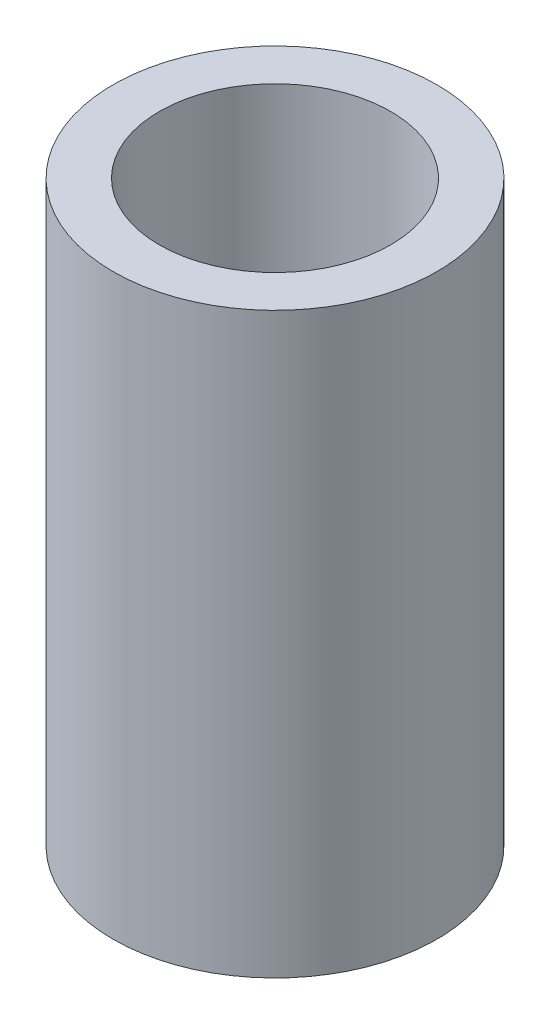
ISO-10303-21;
HEADER;
FILE_DESCRIPTION(('STEP AP214'),'2;1');
FILE_NAME('part.step','',(''),(''),'','','');
FILE_SCHEMA(('AUTOMOTIVE_DESIGN { 1 0 10303 214 1 1 1 1 }'));
ENDSEC;
DATA;
#1=APPLICATION_CONTEXT('core data for automotive mechanical design processes');
#2=APPLICATION_PROTOCOL_DEFINITION('international standard','automotive_design',2000,#1);
#3=PRODUCT_CONTEXT('',#1,'mechanical');
#4=PRODUCT('Part','Part','',(#3));
#5=PRODUCT_RELATED_PRODUCT_CATEGORY('part','',(#4));
#6=PRODUCT_DEFINITION_FORMATION('','',#4);
#7=PRODUCT_DEFINITION_CONTEXT('part definition',#1,'design');
#8=PRODUCT_DEFINITION('design','',#6,#7);
#9=PRODUCT_DEFINITION_SHAPE('','',#8);
#10=(LENGTH_UNIT() NAMED_UNIT(*) SI_UNIT(.MILLI.,.METRE.));
#11=(NAMED_UNIT(*) PLANE_ANGLE_UNIT() SI_UNIT($,.RADIAN.));
#12=(NAMED_UNIT(*) SI_UNIT($,.STERADIAN.) SOLID_ANGLE_UNIT());
#13=UNCERTAINTY_MEASURE_WITH_UNIT(LENGTH_MEASURE(1.E-05),#10,'distance_accuracy_value','');
#14=(GEOMETRIC_REPRESENTATION_CONTEXT(3) GLOBAL_UNCERTAINTY_ASSIGNED_CONTEXT((#13)) GLOBAL_UNIT_ASSIGNED_CONTEXT((#10,
#11,#12)) REPRESENTATION_CONTEXT('',''));
#15=CARTESIAN_POINT('',(0.,0.,0.));
#16=DIRECTION('',(0.,0.,1.));
#17=DIRECTION('',(1.,0.,0.));
#18=AXIS2_PLACEMENT_3D('',#15,#16,#17);
#19=CARTESIAN_POINT('',(0.,12.5,0.));
#20=DIRECTION('',(0.,1.,0.));
#21=DIRECTION('',(0.,0.,1.));
#22=AXIS2_PLACEMENT_3D('',#19,#20,#21);
#23=PLANE('',#22);
#24=CARTESIAN_POINT('',(0.,12.5,0.));
#25=DIRECTION('',(0.,1.,0.));
#26=DIRECTION('',(0.,0.,1.));
#27=AXIS2_PLACEMENT_3D('',#24,#25,#26);
#28=CIRCLE('',#27,3.);
#29=CARTESIAN_POINT('',(0.,12.5,3.));
#30=VERTEX_POINT('',#29);
#31=EDGE_CURVE('E43',#30,#30,#28,.T.);
#32=ORIENTED_EDGE('',*,*,#31,.F.);
#33=EDGE_LOOP('',(#32));
#34=FACE_BOUND('',#33,.T.);
#35=CARTESIAN_POINT('',(0.,12.5,0.));
#36=DIRECTION('',(0.,1.,0.));
#37=DIRECTION('',(0.,0.,1.));
#38=AXIS2_PLACEMENT_3D('',#35,#36,#37);
#39=CIRCLE('',#38,5.);
#40=CARTESIAN_POINT('',(0.,12.5,5.));
#41=VERTEX_POINT('',#40);
#42=EDGE_CURVE('E10',#41,#41,#39,.F.);
#43=ORIENTED_EDGE('',*,*,#42,.F.);
#44=EDGE_LOOP('',(#43));
#45=FACE_BOUND('',#44,.T.);
#46=ADVANCED_FACE('F32',(#34,#45),#23,.T.);
#47=CARTESIAN_POINT('',(0.,0.,0.));
#48=DIRECTION('',(0.,1.,0.));
#49=DIRECTION('',(0.,0.,1.));
#50=AXIS2_PLACEMENT_3D('',#47,#48,#49);
#51=PLANE('',#50);
#52=CARTESIAN_POINT('',(0.,0.,0.));
#53=DIRECTION('',(0.,1.,0.));
#54=DIRECTION('',(0.,0.,1.));
#55=AXIS2_PLACEMENT_3D('',#52,#53,#54);
#56=CIRCLE('',#55,7.);
#57=CARTESIAN_POINT('',(0.,0.,7.));
#58=VERTEX_POINT('',#57);
#59=EDGE_CURVE('E39',#58,#58,#56,.T.);
#60=ORIENTED_EDGE('',*,*,#59,.F.);
#61=EDGE_LOOP('',(#60));
#62=FACE_BOUND('',#61,.T.);
#63=CARTESIAN_POINT('',(0.,0.,0.));
#64=DIRECTION('',(0.,1.,0.));
#65=DIRECTION('',(0.,0.,1.));
#66=AXIS2_PLACEMENT_3D('',#63,#64,#65);
#67=CIRCLE('',#66,3.);
#68=CARTESIAN_POINT('',(0.,0.,3.));
#69=VERTEX_POINT('',#68);
#70=EDGE_CURVE('E47',#69,#69,#67,.T.);
#71=ORIENTED_EDGE('',*,*,#70,.T.);
#72=EDGE_LOOP('',(#71));
#73=FACE_BOUND('',#72,.T.);
#74=ADVANCED_FACE('F74',(#62,#73),#51,.F.);
#75=CARTESIAN_POINT('',(0.,12.5,0.));
#76=DIRECTION('',(0.,-1.,0.));
#77=DIRECTION('',(0.,0.,-1.));
#78=AXIS2_PLACEMENT_3D('',#75,#76,#77);
#79=CYLINDRICAL_SURFACE('',#78,7.);
#80=ORIENTED_EDGE('',*,*,#59,.T.);
#81=EDGE_LOOP('',(#80));
#82=FACE_BOUND('',#81,.T.);
#83=CARTESIAN_POINT('',(0.,25.,0.));
#84=DIRECTION('',(0.,1.,0.));
#85=DIRECTION('',(0.,0.,1.));
#86=AXIS2_PLACEMENT_3D('',#83,#84,#85);
#87=CIRCLE('',#86,7.);
#88=CARTESIAN_POINT('',(0.,25.,7.));
#89=VERTEX_POINT('',#88);
#90=EDGE_CURVE('E51',#89,#89,#87,.T.);
#91=ORIENTED_EDGE('',*,*,#90,.F.);
#92=EDGE_LOOP('',(#91));
#93=FACE_BOUND('',#92,.T.);
#94=ADVANCED_FACE('F34',(#82,#93),#79,.T.);
#95=CARTESIAN_POINT('',(0.,12.5,0.));
#96=DIRECTION('',(0.,-1.,0.));
#97=DIRECTION('',(0.,0.,-1.));
#98=AXIS2_PLACEMENT_3D('',#95,#96,#97);
#99=CYLINDRICAL_SURFACE('',#98,3.);
#100=ORIENTED_EDGE('',*,*,#31,.T.);
#101=EDGE_LOOP('',(#100));
#102=FACE_BOUND('',#101,.T.);
#103=ORIENTED_EDGE('',*,*,#70,.F.);
#104=EDGE_LOOP('',(#103));
#105=FACE_BOUND('',#104,.T.);
#106=ADVANCED_FACE('F63',(#102,#105),#99,.F.);
#107=CARTESIAN_POINT('',(0.,25.,0.));
#108=DIRECTION('',(0.,1.,0.));
#109=DIRECTION('',(0.,0.,1.));
#110=AXIS2_PLACEMENT_3D('',#107,#108,#109);
#111=PLANE('',#110);
#112=ORIENTED_EDGE('',*,*,#90,.T.);
#113=EDGE_LOOP('',(#112));
#114=FACE_BOUND('',#113,.T.);
#115=CARTESIAN_POINT('',(0.,25.,0.));
#116=DIRECTION('',(0.,1.,0.));
#117=DIRECTION('',(0.,0.,1.));
#118=AXIS2_PLACEMENT_3D('',#115,#116,#117);
#119=CIRCLE('',#118,5.);
#120=CARTESIAN_POINT('',(0.,25.,5.));
#121=VERTEX_POINT('',#120);
#122=EDGE_CURVE('E55',#121,#121,#119,.T.);
#123=ORIENTED_EDGE('',*,*,#122,.F.);
#124=EDGE_LOOP('',(#123));
#125=FACE_BOUND('',#124,.T.);
#126=ADVANCED_FACE('F61',(#114,#125),#111,.T.);
#127=CARTESIAN_POINT('',(0.,25.,0.));
#128=DIRECTION('',(0.,-1.,0.));
#129=DIRECTION('',(0.,0.,-1.));
#130=AXIS2_PLACEMENT_3D('',#127,#128,#129);
#131=CYLINDRICAL_SURFACE('',#130,5.);
#132=ORIENTED_EDGE('',*,*,#122,.T.);
#133=EDGE_LOOP('',(#132));
#134=FACE_BOUND('',#133,.T.);
#135=ORIENTED_EDGE('',*,*,#42,.T.);
#136=EDGE_LOOP('',(#135));
#137=FACE_BOUND('',#136,.T.);
#138=ADVANCED_FACE('F59',(#134,#137),#131,.F.);
#139=CLOSED_SHELL('',(#46,#74,#94,#106,#126,#138));
#140=MANIFOLD_SOLID_BREP('B2',#139);
#141=ADVANCED_BREP_SHAPE_REPRESENTATION('',(#18,#140),#14);
#142=SHAPE_DEFINITION_REPRESENTATION(#9,#141);
ENDSEC;
END-ISO-10303-21;
